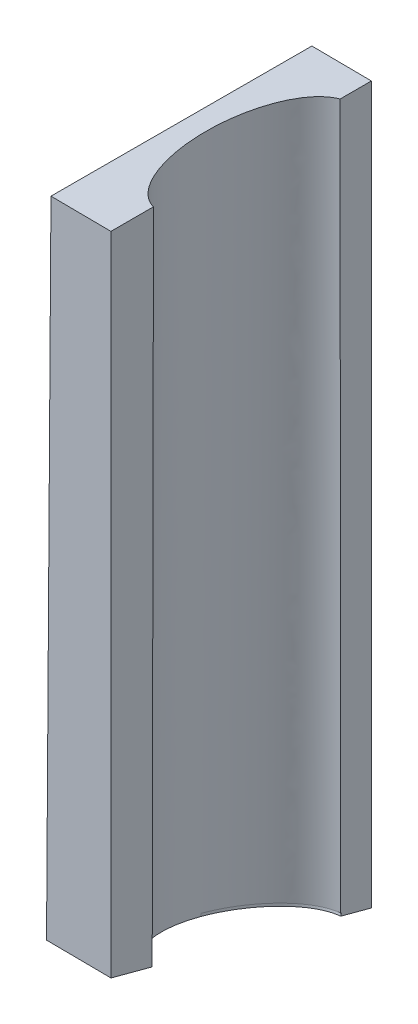
ISO-10303-21;
HEADER;
FILE_DESCRIPTION(('STEP AP214'),'2;1');
FILE_NAME('part.step','',(''),(''),'','','');
FILE_SCHEMA(('AUTOMOTIVE_DESIGN { 1 0 10303 214 1 1 1 1 }'));
ENDSEC;
DATA;
#1=APPLICATION_CONTEXT('core data for automotive mechanical design processes');
#2=APPLICATION_PROTOCOL_DEFINITION('international standard','automotive_design',2000,#1);
#3=PRODUCT_CONTEXT('',#1,'mechanical');
#4=PRODUCT('Part','Part','',(#3));
#5=PRODUCT_RELATED_PRODUCT_CATEGORY('part','',(#4));
#6=PRODUCT_DEFINITION_FORMATION('','',#4);
#7=PRODUCT_DEFINITION_CONTEXT('part definition',#1,'design');
#8=PRODUCT_DEFINITION('design','',#6,#7);
#9=PRODUCT_DEFINITION_SHAPE('','',#8);
#10=(LENGTH_UNIT() NAMED_UNIT(*) SI_UNIT(.MILLI.,.METRE.));
#11=(NAMED_UNIT(*) PLANE_ANGLE_UNIT() SI_UNIT($,.RADIAN.));
#12=(NAMED_UNIT(*) SI_UNIT($,.STERADIAN.) SOLID_ANGLE_UNIT());
#13=UNCERTAINTY_MEASURE_WITH_UNIT(LENGTH_MEASURE(1.E-05),#10,'distance_accuracy_value','');
#14=(GEOMETRIC_REPRESENTATION_CONTEXT(3) GLOBAL_UNCERTAINTY_ASSIGNED_CONTEXT((#13)) GLOBAL_UNIT_ASSIGNED_CONTEXT((#10,
#11,#12)) REPRESENTATION_CONTEXT('',''));
#15=CARTESIAN_POINT('',(0.,0.,0.));
#16=DIRECTION('',(0.,0.,1.));
#17=DIRECTION('',(1.,0.,0.));
#18=AXIS2_PLACEMENT_3D('',#15,#16,#17);
#19=CARTESIAN_POINT('',(0.,-129.19019701701,73.3779085866653));
#20=DIRECTION('',(1.,0.,0.));
#21=DIRECTION('',(0.,1.,0.));
#22=AXIS2_PLACEMENT_3D('',#19,#20,#21);
#23=PLANE('',#22);
#24=DIRECTION('',(0.,-0.999999994195562,-0.000107744494899412));
#25=VECTOR('',#24,1.);
#26=CARTESIAN_POINT('',(0.,-240.151174535463,173.378474638534));
#27=LINE('',#26,#25);
#28=CARTESIAN_POINT('',(0.,145.808737300821,173.420059694528));
#29=VERTEX_POINT('',#28);
#30=CARTESIAN_POINT('',(0.,-350.748398343116,173.366558396449));
#31=VERTEX_POINT('',#30);
#32=EDGE_CURVE('E129',#29,#31,#27,.T.);
#33=ORIENTED_EDGE('',*,*,#32,.T.);
#34=DIRECTION('',(0.,-0.258062971997087,-0.96612809838242));
#35=VECTOR('',#34,1.);
#36=CARTESIAN_POINT('',(0.,-382.552477501849,54.2994396980824));
#37=LINE('',#36,#35);
#38=CARTESIAN_POINT('',(0.,-359.202276889901,141.717191805211));
#39=VERTEX_POINT('',#38);
#40=EDGE_CURVE('E204',#31,#39,#37,.T.);
#41=ORIENTED_EDGE('',*,*,#40,.T.);
#42=CARTESIAN_POINT('',(0.000201890108233018,145.812651451591,140.728958262925));
#43=CARTESIAN_POINT('',(0.000191875866967415,128.28809062265,140.776378669495));
#44=CARTESIAN_POINT('',(0.000169140988741954,110.763526062805,140.822419895726));
#45=CARTESIAN_POINT('',(0.000110936791715465,74.7095836954584,140.914316468826));
#46=CARTESIAN_POINT('',(7.48120598761139E-05,56.1802054748533,140.960009795918));
#47=CARTESIAN_POINT('',(5.24059400907373E-06,18.1166239933515,141.050733823848));
#48=CARTESIAN_POINT('',(-2.79546841325386E-05,-1.41757967353998,141.09559422057));
#49=CARTESIAN_POINT('',(-8.26228839861342E-05,-41.4909026072428,141.184146486714));
#50=CARTESIAN_POINT('',(-0.000103404917467738,-62.0300222693478,141.227659522903));
#51=CARTESIAN_POINT('',(-0.000128290059961039,-104.113360552314,141.312983371043));
#52=CARTESIAN_POINT('',(-0.000131527211900925,-125.657579553452,141.354606684126));
#53=CARTESIAN_POINT('',(-0.000122291077462045,-169.751408454287,141.435588647108));
#54=CARTESIAN_POINT('',(-0.000109077597693092,-192.301018714691,141.474750970315));
#55=CARTESIAN_POINT('',(-7.41477954990421E-05,-238.406048584298,141.550219682335));
#56=CARTESIAN_POINT('',(-5.2078501046694E-05,-261.961468529709,141.586320771232));
#57=CARTESIAN_POINT('',(-1.52025129144753E-05,-310.078683329636,141.655045716966));
#58=CARTESIAN_POINT('',(-7.46385112578835E-07,-334.640478490609,141.687455119679));
#59=CARTESIAN_POINT('',(0.,-359.2022768899,141.717191805211));
#60=B_SPLINE_CURVE_WITH_KNOTS('',3,(#42,#43,#44,#45,#46,#47,#48,#49,#50,#51,#52,#53,#54,#55,#56,
#57,#58,#59),.UNSPECIFIED.,.F.,.F.,(4,2,2,2,2,2,2,2,4),(0.,52.5738749072877,108.162178334121,
166.764943573395,228.382440494907,293.015217729692,360.664150082242,431.330492398781,
505.015941447295),.UNSPECIFIED.);
#61=CARTESIAN_POINT('',(7.30360216749659E-12,145.812660768224,140.732401190884));
#62=VERTEX_POINT('',#61);
#63=EDGE_CURVE('E87',#39,#62,#60,.F.);
#64=ORIENTED_EDGE('',*,*,#63,.T.);
#65=DIRECTION('',(0.,-0.000120029012613242,0.999999992796518));
#66=VECTOR('',#65,1.);
#67=CARTESIAN_POINT('',(0.,145.814733626046,123.462761446727));
#68=LINE('',#67,#66);
#69=EDGE_CURVE('E138',#62,#29,#68,.T.);
#70=ORIENTED_EDGE('',*,*,#69,.T.);
#71=EDGE_LOOP('',(#33,#41,#64,#70));
#72=FACE_BOUND('',#71,.T.);
#73=ADVANCED_FACE('F16',(#72),#23,.T.);
#74=CARTESIAN_POINT('',(0.,-129.19019701701,73.3779085866653));
#75=DIRECTION('',(1.,0.,0.));
#76=DIRECTION('',(0.,1.,0.));
#77=AXIS2_PLACEMENT_3D('',#74,#75,#76);
#78=PLANE('',#77);
#79=CARTESIAN_POINT('',(2.8611690534847E-10,-395.793351152422,-3.02157795927953));
#80=CARTESIAN_POINT('',(-0.000570684318163415,-373.220203906049,-3.01898063853125));
#81=CARTESIAN_POINT('',(-0.00109817314948076,-350.647056922307,-3.01412065351724));
#82=CARTESIAN_POINT('',(-0.00204127082803755,-305.501451351252,-2.99989152048068));
#83=CARTESIAN_POINT('',(-0.00245688307967875,-282.928992763896,-2.99052250969187));
#84=CARTESIAN_POINT('',(-0.00315075948876221,-237.785217015565,-2.96729191677084));
#85=CARTESIAN_POINT('',(-0.00342903057639252,-215.213899854474,-2.95343056137928));
#86=CARTESIAN_POINT('',(-0.00382269076135364,-170.072851163463,-2.92123181223199));
#87=CARTESIAN_POINT('',(-0.0039380912767081,-147.503119633319,-2.90289473235216));
#88=CARTESIAN_POINT('',(-0.00398044226464023,-102.365679097823,-2.86176112305207));
#89=CARTESIAN_POINT('',(-0.00390740958977901,-79.7979700921065,-2.83896499259643));
#90=CARTESIAN_POINT('',(-0.0035472916112637,-34.6650055720839,-2.78892988975611));
#91=CARTESIAN_POINT('',(-0.00326022953284122,-12.0997500572426,-2.76169139968113));
#92=CARTESIAN_POINT('',(-0.00244642895871443,33.0278811810531,-2.70278823785501));
#93=CARTESIAN_POINT('',(-0.001919720993844,55.5902569052445,-2.67112413028249));
#94=CARTESIAN_POINT('',(-0.000600970199715687,100.711705797515,-2.60338634792644));
#95=CARTESIAN_POINT('',(0.00019103385806574,123.270778966564,-2.56731331797017));
#96=CARTESIAN_POINT('',(0.00112859110134016,145.829848395325,-2.52904081687151));
#97=B_SPLINE_CURVE_WITH_KNOTS('',3,(#79,#80,#81,#82,#83,#84,#85,#86,#87,#88,#89,#90,#91,#92,#93,
#94,#95,#96),.UNSPECIFIED.,.F.,.F.,(4,2,2,2,2,2,2,2,4),(0.,67.7194420906442,135.43682324721,
203.150787058502,270.860003553933,338.563164671581,406.258980103266,473.946173516627,
541.623479154221),.UNSPECIFIED.);
#98=CARTESIAN_POINT('',(2.86259405068989E-09,145.829856670985,-2.53215046058112));
#99=VERTEX_POINT('',#98);
#100=CARTESIAN_POINT('',(1.87141968588378E-13,-395.79335115241,-3.02157795924113));
#101=VERTEX_POINT('',#100);
#102=EDGE_CURVE('E117',#99,#101,#97,.F.);
#103=ORIENTED_EDGE('',*,*,#102,.T.);
#104=DIRECTION('',(0.,-0.258062971997087,-0.96612809838242));
#105=VECTOR('',#104,1.);
#106=CARTESIAN_POINT('',(0.,-367.804885635952,101.760765500564));
#107=LINE('',#106,#105);
#108=CARTESIAN_POINT('',(0.,-395.930753738855,-3.5359814729575));
#109=VERTEX_POINT('',#108);
#110=EDGE_CURVE('E262',#101,#109,#107,.T.);
#111=ORIENTED_EDGE('',*,*,#110,.T.);
#112=CARTESIAN_POINT('',(0.,-579.446730856724,122.938892376905));
#113=DIRECTION('',(-1.,0.,0.));
#114=DIRECTION('',(0.,0.966217976009637,-0.257726255619873));
#115=AXIS2_PLACEMENT_3D('',#112,#113,#114);
#116=ELLIPSE('',#115,4850.93423795068,74.975640367503);
#117=CARTESIAN_POINT('',(0.,-397.863584019476,-3.0218029022411));
#118=VERTEX_POINT('',#117);
#119=EDGE_CURVE('E10',#109,#118,#116,.T.);
#120=ORIENTED_EDGE('',*,*,#119,.T.);
#121=DIRECTION('',(0.,-0.258062971997087,-0.96612809838242));
#122=VECTOR('',#121,1.);
#123=CARTESIAN_POINT('',(0.,-382.552477501849,54.2994396980824));
#124=LINE('',#123,#122);
#125=CARTESIAN_POINT('',(0.,-404.180731627926,-26.6717429107662));
#126=VERTEX_POINT('',#125);
#127=EDGE_CURVE('E107',#118,#126,#124,.T.);
#128=ORIENTED_EDGE('',*,*,#127,.T.);
#129=DIRECTION('',(0.,0.999999986163388,0.000166352709822038));
#130=VECTOR('',#129,1.);
#131=CARTESIAN_POINT('',(0.,8.13970418107693,-26.6031522880052));
#132=LINE('',#131,#130);
#133=CARTESIAN_POINT('',(0.,145.83274314029,-26.5802466775338));
#134=VERTEX_POINT('',#133);
#135=EDGE_CURVE('E140',#126,#134,#132,.T.);
#136=ORIENTED_EDGE('',*,*,#135,.T.);
#137=DIRECTION('',(0.,-0.000120029012613242,0.999999992796518));
#138=VECTOR('',#137,1.);
#139=CARTESIAN_POINT('',(0.,145.814733626046,123.462761446727));
#140=LINE('',#139,#138);
#141=EDGE_CURVE('E135',#134,#99,#140,.T.);
#142=ORIENTED_EDGE('',*,*,#141,.T.);
#143=EDGE_LOOP('',(#103,#111,#120,#128,#136,#142));
#144=FACE_BOUND('',#143,.T.);
#145=ADVANCED_FACE('F142',(#144),#78,.T.);
#146=CARTESIAN_POINT('',(0.,-397.863584019476,-3.02180290224102));
#147=CARTESIAN_POINT('',(-33.6371271463662,-396.412382812834,1.47037849310987));
#148=CARTESIAN_POINT('',(-33.509460233256,-377.808424699888,71.1228667536555));
#149=CARTESIAN_POINT('',(0.0144348984358672,-395.931378150499,-3.53791540315402));
#150=CARTESIAN_POINT('',(-33.6226922479303,-394.480176943856,0.954265992196871));
#151=CARTESIAN_POINT('',(-33.4950253348202,-375.876218830911,70.6067542527425));
#152=(BOUNDED_SURFACE() B_SPLINE_SURFACE(1,2,((#146,#147,#148),(#149,#150,#151)),.UNSPECIFIED.,
.F.,.F.,.F.) B_SPLINE_SURFACE_WITH_KNOTS((2,2),(3,3),(0.,0.0266666666666681),(-3.06989753197487,
-1.5381880428251),.UNSPECIFIED.) GEOMETRIC_REPRESENTATION_ITEM() RATIONAL_B_SPLINE_SURFACE(((1.,
0.720790151749519,1.),(1.,0.720790151749519,1.))) REPRESENTATION_ITEM('') SURFACE());
#153=CARTESIAN_POINT('',(1.51518044723529,-376.629886268809,68.7643809709538));
#154=DIRECTION('',(0.00721744921792192,0.966102934488423,-0.258056250456453));
#155=DIRECTION('',(-0.0134497848631652,0.258133415883884,0.966015653543592));
#156=AXIS2_PLACEMENT_3D('',#153,#154,#155);
#157=ELLIPSE('',#156,75.,35.);
#158=CARTESIAN_POINT('',(-33.4950253348202,-375.876218830915,70.6067542527312));
#159=VERTEX_POINT('',#158);
#160=EDGE_CURVE('E29',#109,#159,#157,.T.);
#161=CARTESIAN_POINT('',(-33.4950253665937,-375.876223461175,70.6067369172168));
#162=CARTESIAN_POINT('',(-33.4956464417945,-375.959591445919,70.6175366303595));
#163=CARTESIAN_POINT('',(-33.4962663705527,-376.042959573174,70.6283353093339));
#164=CARTESIAN_POINT('',(-33.497503936015,-376.20969638707,70.6499306371747));
#165=CARTESIAN_POINT('',(-33.4981215727114,-376.293065073712,70.6607272860342));
#166=CARTESIAN_POINT('',(-33.4993545528167,-376.459803005704,70.6823185562294));
#167=CARTESIAN_POINT('',(-33.4999698962181,-376.543172251053,70.6931131775583));
#168=CARTESIAN_POINT('',(-33.5011982885009,-376.709911299777,70.7147003952803));
#169=CARTESIAN_POINT('',(-33.5018113373748,-376.793281103152,70.7254929916667));
#170=CARTESIAN_POINT('',(-33.5030351393708,-376.960021267242,70.7470761620951));
#171=CARTESIAN_POINT('',(-33.5036458924854,-377.043391627959,70.7578667361303));
#172=CARTESIAN_POINT('',(-33.5048651017318,-377.21013290605,70.7794458644509));
#173=CARTESIAN_POINT('',(-33.5054735578561,-377.293503823425,70.7902344187295));
#174=CARTESIAN_POINT('',(-33.5066881718915,-377.460246214148,70.8118095101344));
#175=CARTESIAN_POINT('',(-33.507294329795,-377.543617687496,70.822596047254));
#176=CARTESIAN_POINT('',(-33.5085043461595,-377.71036118948,70.8441671069426));
#177=CARTESIAN_POINT('',(-33.5091082046128,-377.793733218117,70.8549516295049));
#178=CARTESIAN_POINT('',(-33.5097109117427,-377.877105387475,70.8657351284275));
#179=B_SPLINE_CURVE_WITH_KNOTS('',3,(#161,#162,#163,#164,#165,#166,#167,#168,#169,#170,#171,
#172,#173,#174,#175,#176,#177,#178),.UNSPECIFIED.,.F.,.F.,(4,2,2,2,2,2,2,2,4),(0.,
0.252200641873684,0.504402115102693,0.756604418972184,1.00880755276515,1.2610115157634,
1.51321630724719,1.76542192649453,2.01762837278251),.UNSPECIFIED.);
#180=CARTESIAN_POINT('',(-33.5097109139638,-377.877110462683,70.8657161279627));
#181=VERTEX_POINT('',#180);
#182=EDGE_CURVE('E97',#159,#181,#179,.T.);
#183=CARTESIAN_POINT('',(1.50074554879945,-378.562092137785,69.2804934718667));
#184=DIRECTION('',(0.00721744921792189,0.966102934488424,-0.25805625045645));
#185=DIRECTION('',(-0.0134497848631652,0.258133415883881,0.966015653543592));
#186=AXIS2_PLACEMENT_3D('',#183,#184,#185);
#187=ELLIPSE('',#186,75.,35.);
#188=EDGE_CURVE('E205',#118,#181,#187,.T.);
#189=ORIENTED_EDGE('',*,*,#119,.F.);
#190=ORIENTED_EDGE('',*,*,#160,.T.);
#191=ORIENTED_EDGE('',*,*,#182,.T.);
#192=ORIENTED_EDGE('',*,*,#188,.F.);
#193=EDGE_LOOP('',(#189,#190,#191,#192));
#194=FACE_BOUND('',#193,.T.);
#195=ADVANCED_FACE('F175',(#194),#152,.T.);
#196=CARTESIAN_POINT('',(1.51518044723529,-376.629886268809,68.7643809709538));
#197=DIRECTION('',(-0.00721744921792192,-0.966102934488423,0.258056250456453));
#198=DIRECTION('',(-0.999972095612311,0.00747047499989484,0.));
#199=AXIS2_PLACEMENT_3D('',#196,#197,#198);
#200=PLANE('',#199);
#201=ORIENTED_EDGE('',*,*,#110,.F.);
#202=CARTESIAN_POINT('',(-33.4937457879016,-375.876227788818,70.6067586373444));
#203=CARTESIAN_POINT('',(-33.491457635087,-376.255275491449,69.1877554290541));
#204=CARTESIAN_POINT('',(-33.4693420292104,-376.634423567172,67.768890196258));
#205=CARTESIAN_POINT('',(-33.3855946230687,-377.387468301073,64.9518586292624));
#206=CARTESIAN_POINT('',(-33.3245107005884,-377.761365438533,63.5536760988127));
#207=CARTESIAN_POINT('',(-33.0863287197048,-378.863210153925,59.4348951557175));
#208=CARTESIAN_POINT('',(-32.8541456369076,-379.590793973643,56.7171265484344));
#209=CARTESIAN_POINT('',(-32.2458365362101,-381.011459715272,51.4146931428609));
#210=CARTESIAN_POINT('',(-31.8762926131301,-381.704686176622,48.8293075989571));
#211=CARTESIAN_POINT('',(-31.0101874091915,-383.049969817052,43.8162110914639));
#212=CARTESIAN_POINT('',(-30.5212148423181,-383.702296194243,41.3872815778162));
#213=CARTESIAN_POINT('',(-29.6907832091753,-384.660571097138,37.8223147521574));
#214=CARTESIAN_POINT('',(-29.4057109433113,-384.969440511866,36.67375154737));
#215=CARTESIAN_POINT('',(-28.810374541694,-385.574926374311,34.4232238847335));
#216=CARTESIAN_POINT('',(-28.501257278056,-385.871609865844,33.3209758490114));
#217=CARTESIAN_POINT('',(-27.8596380749032,-386.452195680611,31.1650111830193));
#218=CARTESIAN_POINT('',(-27.5283486757514,-386.736179146007,30.1109561095663));
#219=CARTESIAN_POINT('',(-26.8440591022749,-387.290909114125,28.0530418978574));
#220=CARTESIAN_POINT('',(-26.4923407931065,-387.561752333038,27.0487838159327));
#221=CARTESIAN_POINT('',(-25.7688374583667,-388.089840471663,25.0917741070202));
#222=CARTESIAN_POINT('',(-25.398397574378,-388.347199330627,24.1385570474259));
#223=CARTESIAN_POINT('',(-24.6396001722238,-388.848162797428,22.2841530451176));
#224=CARTESIAN_POINT('',(-24.2526121393378,-389.091896847262,21.3824418493646));
#225=CARTESIAN_POINT('',(-23.46268859288,-389.565508059185,19.6313783517768));
#226=CARTESIAN_POINT('',(-23.061147105099,-389.795531446329,18.781438183836));
#227=CARTESIAN_POINT('',(-22.2439929500437,-390.241656547181,17.1341059011871));
#228=CARTESIAN_POINT('',(-21.8297979499517,-390.457922750982,16.3360568018466));
#229=CARTESIAN_POINT('',(-20.9891079255418,-390.876503892312,14.7925665605344));
#230=CARTESIAN_POINT('',(-20.5640528343588,-391.079003240272,14.0463931741633));
#231=CARTESIAN_POINT('',(-19.7033167017847,-391.470054645112,12.6065908724729));
#232=CARTESIAN_POINT('',(-19.2690948537855,-391.658812781851,11.9121480099381));
#233=CARTESIAN_POINT('',(-18.3916077320545,-392.022417936563,10.5756248743942));
#234=CARTESIAN_POINT('',(-17.9498159454764,-392.197494467911,9.93264251065713));
#235=CARTESIAN_POINT('',(-17.0586800430629,-392.533801965979,8.69875068065635));
#236=CARTESIAN_POINT('',(-16.6108165572067,-392.695287623261,8.10684467942349));
#237=CARTESIAN_POINT('',(-15.7089618117486,-393.004511224117,6.97469638081362));
#238=CARTESIAN_POINT('',(-15.2564472332306,-393.152530315159,6.43335865970272));
#239=CARTESIAN_POINT('',(-14.3465523760798,-393.434946079732,5.40183945300564));
#240=CARTESIAN_POINT('',(-13.8906313732096,-393.569651452062,4.9104599586961));
#241=CARTESIAN_POINT('',(-12.9754709753259,-393.825761042816,3.97760484959836));
#242=CARTESIAN_POINT('',(-12.5176177277415,-393.947492927658,3.53486253823778));
#243=CARTESIAN_POINT('',(-11.5999843114623,-394.178041479736,2.69779135271894));
#244=CARTESIAN_POINT('',(-11.1415001573431,-394.287200266313,2.30214451606459));
#245=CARTESIAN_POINT('',(-10.4446604717362,-394.443480248296,1.73685557767542));
#246=CARTESIAN_POINT('',(-10.2155681751211,-394.493393380175,1.55649768359505));
#247=CARTESIAN_POINT('',(-9.75755675779191,-394.590177453486,1.20716571490252));
#248=CARTESIAN_POINT('',(-9.52877900420932,-394.637093372754,1.03801925252775));
#249=CARTESIAN_POINT('',(-9.07155396161283,-394.727930879057,0.710925771223855));
#250=CARTESIAN_POINT('',(-8.84324022629389,-394.771897932923,0.552804774274154));
#251=CARTESIAN_POINT('',(-8.38708505340696,-394.856887987945,0.247569212393777));
#252=CARTESIAN_POINT('',(-8.15936923246493,-394.897956737666,0.100279858681652));
#253=CARTESIAN_POINT('',(-7.70454935741347,-394.977200368981,-0.183485004434681));
#254=CARTESIAN_POINT('',(-7.477562573054,-395.015421117894,-0.320135491955734));
#255=CARTESIAN_POINT('',(-7.02433459741636,-395.089019485207,-0.582817121661209));
#256=CARTESIAN_POINT('',(-6.79820204478843,-395.124442894448,-0.709022692858577));
#257=CARTESIAN_POINT('',(-6.34681164239568,-395.192497703997,-0.95101029243825));
#258=CARTESIAN_POINT('',(-6.12165355201323,-395.225174612405,-1.06696542223219));
#259=CARTESIAN_POINT('',(-5.67233629218006,-395.287787965816,-1.28864938955435));
#260=CARTESIAN_POINT('',(-5.44826782860283,-395.317769416167,-1.39454917324529));
#261=CARTESIAN_POINT('',(-5.00124923974801,-395.375043805785,-1.59632108482611));
#262=CARTESIAN_POINT('',(-4.77838067151705,-395.402381018208,-1.69236114315788));
#263=CARTESIAN_POINT('',(-4.33387650080631,-395.454419286158,-1.87461360787935));
#264=CARTESIAN_POINT('',(-4.112313301917,-395.479163647253,-1.96099004901609));
#265=CARTESIAN_POINT('',(-3.6705297079592,-395.526068951096,-2.12411658463462));
#266=CARTESIAN_POINT('',(-3.45037265729312,-395.548271995187,-2.20102593658203));
#267=CARTESIAN_POINT('',(-3.01150646014271,-395.59014778471,-2.34542088964932));
#268=CARTESIAN_POINT('',(-2.79285179641644,-395.609861194149,-2.41306010567761));
#269=CARTESIAN_POINT('',(-2.35709054798024,-395.646811141188,-2.53911839022608));
#270=CARTESIAN_POINT('',(-2.14002989191907,-395.6640866827,-2.59768460787766));
#271=CARTESIAN_POINT('',(-1.70755256933814,-395.696214785012,-2.70580211443656));
#272=CARTESIAN_POINT('',(-1.49217367775936,-395.711104478687,-2.75549331046949));
#273=CARTESIAN_POINT('',(-1.0631491008787,-395.738514532438,-2.84606488299907));
#274=CARTESIAN_POINT('',(-0.84953357783869,-395.751069975824,-2.88707727388367));
#275=CARTESIAN_POINT('',(-0.424127084152736,-395.773867344587,-2.96050353225473));
#276=CARTESIAN_POINT('',(-0.212359151309238,-395.784142111938,-2.99304081940413));
#277=CARTESIAN_POINT('',(2.8611690534847E-10,-395.793351152422,-3.02157795927953));
#278=B_SPLINE_CURVE_WITH_KNOTS('',3,(#202,#203,#204,#205,#206,#207,#208,#209,#210,#211,#212,
#213,#214,#215,#216,#217,#218,#219,#220,#221,#222,#223,#224,#225,#226,#227,#228,#229,#230,#231,
#232,#233,#234,#235,#236,#237,#238,#239,#240,#241,#242,#243,#244,#245,#246,#247,#248,#249,#250,
#251,#252,#253,#254,#255,#256,#257,#258,#259,#260,#261,#262,#263,#264,#265,#266,#267,#268,#269,
#270,#271,#272,#273,#274,#275,#276,#277),.UNSPECIFIED.,.F.,.F.,(4,2,2,2,2,2,2,2,2,2,2,2,2,2,2,2,
2,2,2,2,2,2,2,2,2,2,2,2,2,2,2,2,2,2,2,2,2,4),(0.,4.40598215140691,8.75134373852945,
17.2158720404615,25.3183244477634,33.0002053928583,36.6689368766973,40.2161756388567,
43.6380499215191,46.9314690606814,50.0945410398502,53.1271326295032,56.0297703334564,
58.803453658645,61.4496744135003,63.9704369423867,66.368279686288,68.6462982587114,
70.8081699104976,72.8583482636266,74.8026966625188,76.6476091535773,77.5349237844662,
78.3998587158952,79.2432616337306,80.0659899588601,80.8689100930497,81.6528964546038,
82.4188302890228,83.1675982427256,83.9000906918623,84.617199823309,85.3198174710839,
86.0088327185202,86.6851292843617,87.3495827191791,88.0030574467307,88.6464036926178),.UNSPECIFIED.);
#279=EDGE_CURVE('E124',#101,#159,#278,.F.);
#280=ORIENTED_EDGE('',*,*,#279,.T.);
#281=ORIENTED_EDGE('',*,*,#160,.F.);
#282=EDGE_LOOP('',(#201,#280,#281));
#283=FACE_BOUND('',#282,.T.);
#284=ADVANCED_FACE('F232',(#283),#200,.T.);
#285=CARTESIAN_POINT('',(3.75885357049089,145.80364911078,-3.46630089250226));
#286=CARTESIAN_POINT('',(2.50111446202212,-35.4185548239406,-3.31749343961798));
#287=CARTESIAN_POINT('',(1.24337535355335,-216.640758758661,-3.16868598673369));
#288=CARTESIAN_POINT('',(-0.0143637549154235,-397.862962693381,-3.01987853384941));
#289=CARTESIAN_POINT('',(-1.33136607940513,145.839207751589,-2.77198432600765));
#290=CARTESIAN_POINT('',(-2.5887435034561,-35.3219887526923,-2.62662380160566));
#291=CARTESIAN_POINT('',(-3.84610977505358,-216.481049848704,-2.48126332113358));
#292=CARTESIAN_POINT('',(-5.10348719910455,-397.642246352986,-2.3359027967316));
#293=CARTESIAN_POINT('',(-11.4189139575184,145.909115284101,3.27651056325835));
#294=CARTESIAN_POINT('',(-12.6733897271025,-34.7125964323399,3.4151291884321));
#295=CARTESIAN_POINT('',(-13.927869213456,-215.335025188097,3.55374558294736));
#296=CARTESIAN_POINT('',(-15.1823449830401,-395.956736904538,3.69236420812111));
#297=CARTESIAN_POINT('',(-23.4371089772128,145.990701561988,24.652506965092));
#298=CARTESIAN_POINT('',(-24.6815485448433,-32.727829050936,24.7833585218958));
#299=CARTESIAN_POINT('',(-25.9259816630261,-211.445116262908,24.9142136039378));
#300=CARTESIAN_POINT('',(-27.1704212306565,-390.163646875832,25.0450651607415));
#301=CARTESIAN_POINT('',(-30.0948265314414,146.033760249566,54.3036050262427));
#302=CARTESIAN_POINT('',(-31.3254207310075,-30.0430913018577,54.4304938571035));
#303=CARTESIAN_POINT('',(-32.5560174115487,-206.120425039305,54.557379713033));
#304=CARTESIAN_POINT('',(-33.7866116111147,-382.197276590729,54.6842685438938));
#305=CARTESIAN_POINT('',(-30.1350862533083,146.030155521271,86.6843504732827));
#306=CARTESIAN_POINT('',(-31.3506260584671,-27.1626270839768,86.8118231804314));
#307=CARTESIAN_POINT('',(-32.5661628095412,-200.354824404495,86.9392960869712));
#308=CARTESIAN_POINT('',(-33.7817026147001,-373.547607009742,87.0667687941198));
#309=CARTESIAN_POINT('',(-23.5563471492104,145.980606648371,115.712369020044));
#310=CARTESIAN_POINT('',(-24.7584424372378,-24.6257544213767,115.844862264092));
#311=CARTESIAN_POINT('',(-25.9605422659676,-195.232982632826,115.97735648128));
#312=CARTESIAN_POINT('',(-27.162637553995,-365.839343702574,116.109849725327));
#313=CARTESIAN_POINT('',(-11.5894946971738,145.89438495383,135.950644034088));
#314=CARTESIAN_POINT('',(-12.7822821536821,-22.9092939378602,136.091654628121));
#315=CARTESIAN_POINT('',(-13.9750676310263,-191.712592950549,136.232665598755));
#316=CARTESIAN_POINT('',(-15.1678550875346,-360.51627184224,136.373676192789));
#317=CARTESIAN_POINT('',(-1.51771275371066,145.823249815756,141.049449338029));
#318=CARTESIAN_POINT('',(-2.70820896802177,-22.5250771300143,141.197403028149));
#319=CARTESIAN_POINT('',(-3.8987173260019,-190.875731332115,141.345355907109));
#320=CARTESIAN_POINT('',(-5.08921354031301,-359.224058277885,141.493309597229));
#321=CARTESIAN_POINT('',(3.57133066566867,145.787590447573,141.26294161686));
#322=CARTESIAN_POINT('',(2.38088711044579,-22.5423653315847,141.41435834631));
#323=CARTESIAN_POINT('',(1.1904435552229,-190.872321110743,141.56577507576));
#324=CARTESIAN_POINT('',(0.,-359.2022768899,141.717191805211));
#325=(BOUNDED_SURFACE() B_SPLINE_SURFACE(3,3,((#285,#286,#287,#288),(#289,#290,#291,#292),(#293,
#294,#295,#296),(#297,#298,#299,#300),(#301,#302,#303,#304),(#305,#306,#307,#308),(#309,#310,
#311,#312),(#313,#314,#315,#316),(#317,#318,#319,#320),(#321,#322,#323,#324)),.UNSPECIFIED.,.F.,
.F.,.F.) B_SPLINE_SURFACE_WITH_KNOTS((4,1,1,1,1,1,1,4),(4,4),(0.0114759902155164,
0.0809454051939398,0.150414820172363,0.219884235150787,0.28935365012921,0.358823065107633,
0.428292480086057,0.49776189506448),(0.,1.),
.UNSPECIFIED.) GEOMETRIC_REPRESENTATION_ITEM() RATIONAL_B_SPLINE_SURFACE(((1.,1.,1.,1.),(1.,1.,
1.,1.),(1.,1.,1.,1.),(1.,1.,1.,1.),(1.,1.,1.,1.),(1.,1.,1.,1.),(1.,1.,1.,1.),(1.,1.,1.,1.),(1.,
1.,1.,1.),(1.,1.,1.,1.))) REPRESENTATION_ITEM('') SURFACE());
#326=CARTESIAN_POINT('',(0.000201890120061776,145.812659767833,140.728958240423));
#327=CARTESIAN_POINT('',(-3.85454360082912,145.839770071373,139.736048336866));
#328=CARTESIAN_POINT('',(-12.5264396915259,145.901135683433,134.366087815589));
#329=CARTESIAN_POINT('',(-23.5563471492104,145.980606648371,115.712369020044));
#330=CARTESIAN_POINT('',(-30.1350862533083,146.030155521271,86.6843504732827));
#331=CARTESIAN_POINT('',(-30.0948265314414,146.033760249566,54.3036050262427));
#332=CARTESIAN_POINT('',(-23.4371089772128,145.990701561988,24.652506965092));
#333=CARTESIAN_POINT('',(-12.409078657027,145.915837079861,5.03765331549636));
#334=CARTESIAN_POINT('',(-3.79297159872858,145.856249562031,-1.15172940690974));
#335=CARTESIAN_POINT('',(0.000105152053549579,145.829855516908,-2.52866932609101));
#336=(BOUNDED_CURVE() B_SPLINE_CURVE(3,(#326,#327,#328,#329,#330,#331,#332,#333,#334,#335),
.UNSPECIFIED.,.F.,.F.) B_SPLINE_CURVE_WITH_KNOTS((4,1,1,1,1,1,1,4),(-0.481444566622734,
-0.428292480086057,-0.358823065107633,-0.28935365012921,-0.219884235150787,-0.150414820172363,
-0.0809454051939398,-0.0286464960097123),
.UNSPECIFIED.) CURVE() GEOMETRIC_REPRESENTATION_ITEM() RATIONAL_B_SPLINE_CURVE((1.,1.,1.,1.,1.,
1.,1.,1.,1.,1.)) REPRESENTATION_ITEM(''));
#337=EDGE_CURVE('E121',#62,#99,#336,.T.);
#338=CARTESIAN_POINT('',(3.19866793529572E-06,-359.201824594933,141.717191398361));
#339=CARTESIAN_POINT('',(-5.0892103415036,-359.223605933555,141.493309199684));
#340=CARTESIAN_POINT('',(-15.1678518825687,-360.5158182744,136.3736758139));
#341=CARTESIAN_POINT('',(-27.1626343240194,-365.838885291009,116.109849369324));
#342=CARTESIAN_POINT('',(-33.7816993485997,-373.547141648579,87.0667684516064));
#343=CARTESIAN_POINT('',(-33.7866083045638,-382.196803480204,54.6842682029493));
#344=CARTESIAN_POINT('',(-27.1704178869037,-390.163166667235,25.0450648091493));
#345=CARTESIAN_POINT('',(-15.1823416123205,-395.95625158218,3.69236383565914));
#346=CARTESIAN_POINT('',(-5.10348382058836,-397.641759581056,-2.33590318730875));
#347=CARTESIAN_POINT('',(-0.0143603754274057,-397.862475757527,-3.0198789336883));
#348=(BOUNDED_CURVE() B_SPLINE_CURVE(3,(#338,#339,#340,#341,#342,#343,#344,#345,#346,#347),
.UNSPECIFIED.,.F.,.F.) B_SPLINE_CURVE_WITH_KNOTS((4,1,1,1,1,1,1,4),(0.0114759902155164,
0.0809454051939394,0.150414820172363,0.219884235150786,0.289353650129209,0.358823065107633,
0.428292480086057,0.49776189506448),
.UNSPECIFIED.) CURVE() GEOMETRIC_REPRESENTATION_ITEM() RATIONAL_B_SPLINE_CURVE((1.,1.,1.,1.,1.,
1.,1.,1.,1.,1.)) REPRESENTATION_ITEM(''));
#349=EDGE_CURVE('E199',#181,#39,#348,.F.);
#350=ORIENTED_EDGE('',*,*,#102,.F.);
#351=ORIENTED_EDGE('',*,*,#337,.F.);
#352=ORIENTED_EDGE('',*,*,#63,.F.);
#353=ORIENTED_EDGE('',*,*,#349,.F.);
#354=ORIENTED_EDGE('',*,*,#182,.F.);
#355=ORIENTED_EDGE('',*,*,#279,.F.);
#356=EDGE_LOOP('',(#350,#351,#352,#353,#354,#355));
#357=FACE_BOUND('',#356,.T.);
#358=ADVANCED_FACE('F120',(#357),#325,.T.);
#359=CARTESIAN_POINT('',(50.4104892940265,-351.101385784399,173.454961384669));
#360=DIRECTION('',(-0.00175441431514659,-0.000107744329082145,0.999998455209592));
#361=DIRECTION('',(-0.0612977888750722,0.99811952244159,0.));
#362=AXIS2_PLACEMENT_3D('',#359,#360,#361);
#363=PLANE('',#362);
#364=ORIENTED_EDGE('',*,*,#32,.F.);
#365=DIRECTION('',(-0.999973947517079,0.00700207932965845,-0.00175361688292859));
#366=VECTOR('',#365,1.);
#367=CARTESIAN_POINT('',(53.8872373484546,145.431404759602,173.514559725677));
#368=LINE('',#367,#366);
#369=CARTESIAN_POINT('',(-46.1101574032532,146.131612692567,173.339198037384));
#370=VERTEX_POINT('',#369);
#371=EDGE_CURVE('E154',#29,#370,#368,.T.);
#372=ORIENTED_EDGE('',*,*,#371,.T.);
#373=DIRECTION('',(0.007001879570639,0.999975479337479,0.00012002607028666));
#374=VECTOR('',#373,1.);
#375=CARTESIAN_POINT('',(-46.1101574032532,146.131612692567,173.339198037384));
#376=LINE('',#375,#374);
#377=CARTESIAN_POINT('',(-49.5869054576813,-350.401177851434,173.279599696376));
#378=VERTEX_POINT('',#377);
#379=EDGE_CURVE('E147',#378,#370,#376,.T.);
#380=ORIENTED_EDGE('',*,*,#379,.F.);
#381=DIRECTION('',(-0.999973947517079,0.00700207932965845,-0.00175361688292859));
#382=VECTOR('',#381,1.);
#383=CARTESIAN_POINT('',(50.4104892940267,-351.101385784399,173.454961384669));
#384=LINE('',#383,#382);
#385=EDGE_CURVE('E304',#31,#378,#384,.T.);
#386=ORIENTED_EDGE('',*,*,#385,.F.);
#387=EDGE_LOOP('',(#364,#372,#380,#386));
#388=FACE_BOUND('',#387,.T.);
#389=ADVANCED_FACE('F176',(#388),#363,.T.);
#390=CARTESIAN_POINT('',(50.3871430082469,-404.533555592405,-26.5833808640537));
#391=DIRECTION('',(-0.00721744921792193,-0.966102934488423,0.258056250456453));
#392=DIRECTION('',(-0.999972095612311,0.00747047499989485,0.));
#393=AXIS2_PLACEMENT_3D('',#390,#391,#392);
#394=PLANE('',#393);
#395=ORIENTED_EDGE('',*,*,#127,.F.);
#396=ORIENTED_EDGE('',*,*,#188,.T.);
#397=ORIENTED_EDGE('',*,*,#349,.T.);
#398=ORIENTED_EDGE('',*,*,#40,.F.);
#399=ORIENTED_EDGE('',*,*,#385,.T.);
#400=DIRECTION('',(0.000112755920644528,0.258062184091195,0.966128302260204));
#401=VECTOR('',#400,1.);
#402=CARTESIAN_POINT('',(-49.6102517434611,-403.833347659439,-26.7587425523465));
#403=LINE('',#402,#401);
#404=CARTESIAN_POINT('',(-49.610251743461,-403.833347659439,-26.7587425523465));
#405=VERTEX_POINT('',#404);
#406=EDGE_CURVE('E157',#405,#378,#403,.T.);
#407=ORIENTED_EDGE('',*,*,#406,.F.);
#408=DIRECTION('',(-0.999973947517079,0.00700207932965845,-0.00175361688292859));
#409=VECTOR('',#408,1.);
#410=CARTESIAN_POINT('',(50.3871430082469,-404.533555592405,-26.5833808640537));
#411=LINE('',#410,#409);
#412=EDGE_CURVE('E211',#126,#405,#411,.T.);
#413=ORIENTED_EDGE('',*,*,#412,.F.);
#414=EDGE_LOOP('',(#395,#396,#397,#398,#399,#407,#413));
#415=FACE_BOUND('',#414,.T.);
#416=ADVANCED_FACE('F179',(#415),#394,.T.);
#417=CARTESIAN_POINT('',(54.238120211484,145.452953625418,-26.4851313162413));
#418=DIRECTION('',(0.00175482468922767,0.000166352453687768,-0.999998446457379));
#419=DIRECTION('',(0.,-0.999999986163388,-0.000166352709822039));
#420=AXIS2_PLACEMENT_3D('',#417,#418,#419);
#421=PLANE('',#420);
#422=ORIENTED_EDGE('',*,*,#135,.F.);
#423=ORIENTED_EDGE('',*,*,#412,.T.);
#424=DIRECTION('',(-0.00700177673315852,-0.999975471305133,-0.000178635541476949));
#425=VECTOR('',#424,1.);
#426=CARTESIAN_POINT('',(-49.6102517434611,-403.833347659439,-26.7587425523465));
#427=LINE('',#426,#425);
#428=CARTESIAN_POINT('',(-45.7592745402238,146.153161558384,-26.6604930045342));
#429=VERTEX_POINT('',#428);
#430=EDGE_CURVE('E319',#429,#405,#427,.T.);
#431=ORIENTED_EDGE('',*,*,#430,.F.);
#432=DIRECTION('',(-0.999973947517079,0.00700207932965845,-0.00175361688292859));
#433=VECTOR('',#432,1.);
#434=CARTESIAN_POINT('',(54.2381202114841,145.452953625418,-26.4851313162413));
#435=LINE('',#434,#433);
#436=EDGE_CURVE('E146',#134,#429,#435,.T.);
#437=ORIENTED_EDGE('',*,*,#436,.F.);
#438=EDGE_LOOP('',(#422,#423,#431,#437));
#439=FACE_BOUND('',#438,.T.);
#440=ADVANCED_FACE('F183',(#439),#421,.T.);
#441=CARTESIAN_POINT('',(53.8872373484548,145.431404759602,173.514559725677));
#442=DIRECTION('',(0.00700187957063895,0.999975479337479,0.000120026070286936));
#443=DIRECTION('',(0.0171394606670083,0.,-0.999853108655488));
#444=AXIS2_PLACEMENT_3D('',#441,#442,#443);
#445=PLANE('',#444);
#446=ORIENTED_EDGE('',*,*,#141,.F.);
#447=ORIENTED_EDGE('',*,*,#436,.T.);
#448=DIRECTION('',(0.00175441431514661,0.000107744329082477,-0.999998455209592));
#449=VECTOR('',#448,1.);
#450=CARTESIAN_POINT('',(-45.7592745402238,146.153161558384,-26.6604930045342));
#451=LINE('',#450,#449);
#452=EDGE_CURVE('E323',#370,#429,#451,.T.);
#453=ORIENTED_EDGE('',*,*,#452,.F.);
#454=ORIENTED_EDGE('',*,*,#371,.F.);
#455=ORIENTED_EDGE('',*,*,#69,.F.);
#456=ORIENTED_EDGE('',*,*,#337,.T.);
#457=EDGE_LOOP('',(#446,#447,#453,#454,#455,#456));
#458=FACE_BOUND('',#457,.T.);
#459=ADVANCED_FACE('F134',(#458),#445,.T.);
#460=CARTESIAN_POINT('',(-47.6995061535546,-108.795966672405,61.7322717375736));
#461=DIRECTION('',(-0.999973947517079,0.00700207932965845,-0.00175361688292859));
#462=DIRECTION('',(-0.0017536598736513,0.,0.999998462337342));
#463=AXIS2_PLACEMENT_3D('',#460,#461,#462);
#464=PLANE('',#463);
#465=ORIENTED_EDGE('',*,*,#452,.T.);
#466=ORIENTED_EDGE('',*,*,#430,.T.);
#467=ORIENTED_EDGE('',*,*,#406,.T.);
#468=ORIENTED_EDGE('',*,*,#379,.T.);
#469=EDGE_LOOP('',(#465,#466,#467,#468));
#470=FACE_BOUND('',#469,.T.);
#471=ADVANCED_FACE('F243',(#470),#464,.T.);
#472=CLOSED_SHELL('',(#73,#145,#195,#284,#358,#389,#416,#440,#459,#471));
#473=MANIFOLD_SOLID_BREP('B1',#472);
#474=ADVANCED_BREP_SHAPE_REPRESENTATION('',(#18,#473),#14);
#475=SHAPE_DEFINITION_REPRESENTATION(#9,#474);
ENDSEC;
END-ISO-10303-21;
